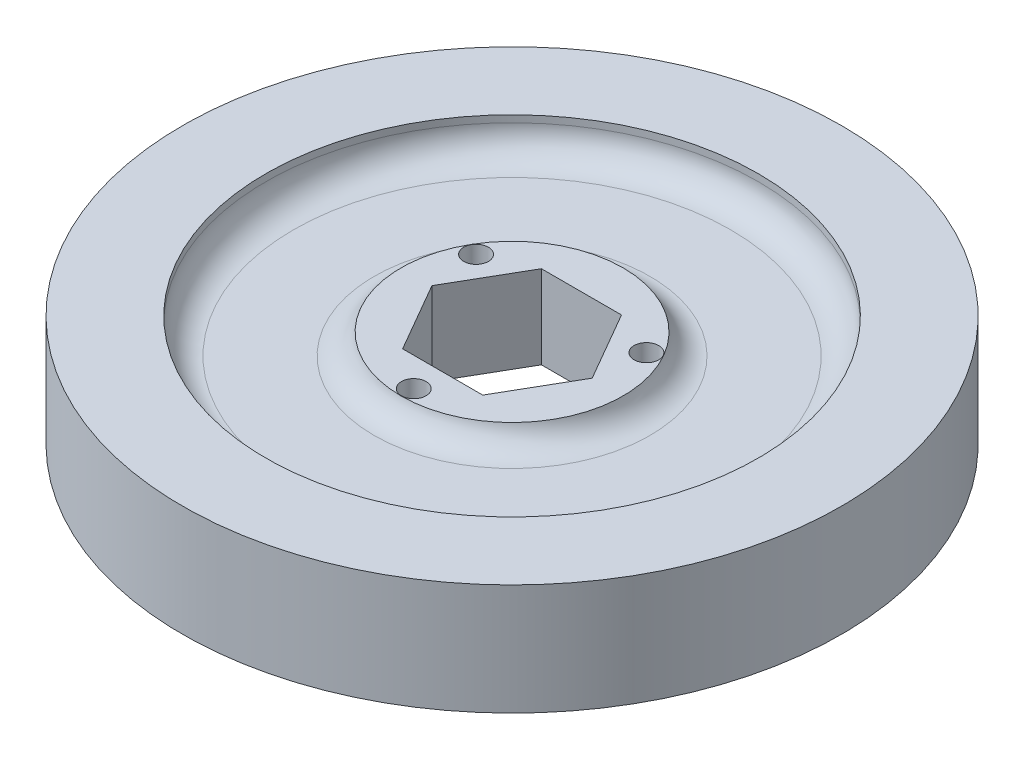
ISO-10303-21;
HEADER;
FILE_DESCRIPTION(('STEP AP214'),'2;1');
FILE_NAME('part.step','',(''),(''),'','','');
FILE_SCHEMA(('AUTOMOTIVE_DESIGN { 1 0 10303 214 1 1 1 1 }'));
ENDSEC;
DATA;
#1=APPLICATION_CONTEXT('core data for automotive mechanical design processes');
#2=APPLICATION_PROTOCOL_DEFINITION('international standard','automotive_design',2000,#1);
#3=PRODUCT_CONTEXT('',#1,'mechanical');
#4=PRODUCT('Part','Part','',(#3));
#5=PRODUCT_RELATED_PRODUCT_CATEGORY('part','',(#4));
#6=PRODUCT_DEFINITION_FORMATION('','',#4);
#7=PRODUCT_DEFINITION_CONTEXT('part definition',#1,'design');
#8=PRODUCT_DEFINITION('design','',#6,#7);
#9=PRODUCT_DEFINITION_SHAPE('','',#8);
#10=(LENGTH_UNIT() NAMED_UNIT(*) SI_UNIT(.MILLI.,.METRE.));
#11=(NAMED_UNIT(*) PLANE_ANGLE_UNIT() SI_UNIT($,.RADIAN.));
#12=(NAMED_UNIT(*) SI_UNIT($,.STERADIAN.) SOLID_ANGLE_UNIT());
#13=UNCERTAINTY_MEASURE_WITH_UNIT(LENGTH_MEASURE(1.E-05),#10,'distance_accuracy_value','');
#14=(GEOMETRIC_REPRESENTATION_CONTEXT(3) GLOBAL_UNCERTAINTY_ASSIGNED_CONTEXT((#13)) GLOBAL_UNIT_ASSIGNED_CONTEXT((#10,
#11,#12)) REPRESENTATION_CONTEXT('',''));
#15=CARTESIAN_POINT('',(0.,0.,0.));
#16=DIRECTION('',(0.,0.,1.));
#17=DIRECTION('',(1.,0.,0.));
#18=AXIS2_PLACEMENT_3D('',#15,#16,#17);
#19=CARTESIAN_POINT('',(0.,-3.81,0.));
#20=DIRECTION('',(0.,-1.,0.));
#21=DIRECTION('',(0.,0.,-1.));
#22=AXIS2_PLACEMENT_3D('',#19,#20,#21);
#23=PLANE('',#22);
#24=CARTESIAN_POINT('',(0.,-3.81,9.00000000000001));
#25=DIRECTION('',(0.,-1.,0.));
#26=DIRECTION('',(0.,0.,-1.));
#27=AXIS2_PLACEMENT_3D('',#24,#25,#26);
#28=CIRCLE('',#27,1.1303);
#29=CARTESIAN_POINT('',(0.,-3.81,7.86970000000001));
#30=VERTEX_POINT('',#29);
#31=EDGE_CURVE('E196',#30,#30,#28,.T.);
#32=ORIENTED_EDGE('',*,*,#31,.F.);
#33=EDGE_LOOP('',(#32));
#34=FACE_BOUND('',#33,.T.);
#35=CARTESIAN_POINT('',(-7.79422863405995,-3.81,-4.5));
#36=DIRECTION('',(0.,-1.,0.));
#37=DIRECTION('',(0.,0.,-1.));
#38=AXIS2_PLACEMENT_3D('',#35,#36,#37);
#39=CIRCLE('',#38,1.1303);
#40=CARTESIAN_POINT('',(-7.79422863405995,-3.81,-5.6303));
#41=VERTEX_POINT('',#40);
#42=EDGE_CURVE('E190',#41,#41,#39,.T.);
#43=ORIENTED_EDGE('',*,*,#42,.F.);
#44=EDGE_LOOP('',(#43));
#45=FACE_BOUND('',#44,.T.);
#46=CARTESIAN_POINT('',(7.79422863405991,-3.81,-4.50000000000007));
#47=DIRECTION('',(0.,-1.,0.));
#48=DIRECTION('',(0.,0.,-1.));
#49=AXIS2_PLACEMENT_3D('',#46,#47,#48);
#50=CIRCLE('',#49,1.1303);
#51=CARTESIAN_POINT('',(7.79422863405991,-3.81,-5.63030000000007));
#52=VERTEX_POINT('',#51);
#53=EDGE_CURVE('E183',#52,#52,#50,.T.);
#54=ORIENTED_EDGE('',*,*,#53,.F.);
#55=EDGE_LOOP('',(#54));
#56=FACE_BOUND('',#55,.T.);
#57=DIRECTION('',(-0.5,0.,0.866025403784438));
#58=VECTOR('',#57,1.);
#59=CARTESIAN_POINT('',(7.33234841870825,-3.81,0.));
#60=LINE('',#59,#58);
#61=CARTESIAN_POINT('',(7.33234841870825,-3.81,0.));
#62=VERTEX_POINT('',#61);
#63=CARTESIAN_POINT('',(3.66617420935412,-3.81,6.35));
#64=VERTEX_POINT('',#63);
#65=EDGE_CURVE('E49',#62,#64,#60,.T.);
#66=ORIENTED_EDGE('',*,*,#65,.F.);
#67=DIRECTION('',(0.5,0.,0.866025403784438));
#68=VECTOR('',#67,1.);
#69=CARTESIAN_POINT('',(3.66617420935412,-3.81,-6.35));
#70=LINE('',#69,#68);
#71=CARTESIAN_POINT('',(3.66617420935412,-3.81,-6.35));
#72=VERTEX_POINT('',#71);
#73=EDGE_CURVE('E113',#72,#62,#70,.T.);
#74=ORIENTED_EDGE('',*,*,#73,.F.);
#75=DIRECTION('',(1.,0.,0.));
#76=VECTOR('',#75,1.);
#77=CARTESIAN_POINT('',(-3.66617420935412,-3.81,-6.35));
#78=LINE('',#77,#76);
#79=CARTESIAN_POINT('',(-3.66617420935412,-3.81,-6.35));
#80=VERTEX_POINT('',#79);
#81=EDGE_CURVE('E107',#80,#72,#78,.T.);
#82=ORIENTED_EDGE('',*,*,#81,.F.);
#83=DIRECTION('',(0.5,0.,-0.866025403784439));
#84=VECTOR('',#83,1.);
#85=CARTESIAN_POINT('',(-7.33234841870824,-3.81,0.));
#86=LINE('',#85,#84);
#87=CARTESIAN_POINT('',(-7.33234841870824,-3.81,0.));
#88=VERTEX_POINT('',#87);
#89=EDGE_CURVE('E105',#88,#80,#86,.T.);
#90=ORIENTED_EDGE('',*,*,#89,.F.);
#91=DIRECTION('',(-0.5,0.,-0.866025403784439));
#92=VECTOR('',#91,1.);
#93=CARTESIAN_POINT('',(-3.66617420935412,-3.81,6.35));
#94=LINE('',#93,#92);
#95=CARTESIAN_POINT('',(-3.66617420935412,-3.81,6.35));
#96=VERTEX_POINT('',#95);
#97=EDGE_CURVE('E89',#96,#88,#94,.T.);
#98=ORIENTED_EDGE('',*,*,#97,.F.);
#99=DIRECTION('',(-1.,0.,0.));
#100=VECTOR('',#99,1.);
#101=CARTESIAN_POINT('',(3.66617420935412,-3.81,6.35));
#102=LINE('',#101,#100);
#103=EDGE_CURVE('E98',#64,#96,#102,.T.);
#104=ORIENTED_EDGE('',*,*,#103,.F.);
#105=EDGE_LOOP('',(#66,#74,#82,#90,#98,#104));
#106=FACE_BOUND('',#105,.T.);
#107=CARTESIAN_POINT('',(0.,-3.81,0.));
#108=DIRECTION('',(0.,-1.,0.));
#109=DIRECTION('',(0.,0.,-1.));
#110=AXIS2_PLACEMENT_3D('',#107,#108,#109);
#111=CIRCLE('',#110,10.16);
#112=CARTESIAN_POINT('',(0.,-3.81,-10.16));
#113=VERTEX_POINT('',#112);
#114=EDGE_CURVE('E139',#113,#113,#111,.T.);
#115=ORIENTED_EDGE('',*,*,#114,.T.);
#116=EDGE_LOOP('',(#115));
#117=FACE_BOUND('',#116,.T.);
#118=ADVANCED_FACE('F34',(#34,#45,#56,#106,#117),#23,.T.);
#119=CARTESIAN_POINT('',(10.16,-1.90499999999999,0.));
#120=DIRECTION('',(0.,-1.,0.));
#121=DIRECTION('',(0.,0.,-1.));
#122=AXIS2_PLACEMENT_3D('',#119,#120,#121);
#123=PLANE('',#122);
#124=CARTESIAN_POINT('',(0.,-1.90499999999999,0.));
#125=DIRECTION('',(0.,-1.,0.));
#126=DIRECTION('',(0.,0.,-1.));
#127=AXIS2_PLACEMENT_3D('',#124,#125,#126);
#128=CIRCLE('',#127,12.6193444248417);
#129=CARTESIAN_POINT('',(0.,-1.90499999999999,-12.6193444248417));
#130=VERTEX_POINT('',#129);
#131=EDGE_CURVE('E154',#130,#130,#128,.F.);
#132=ORIENTED_EDGE('',*,*,#131,.T.);
#133=EDGE_LOOP('',(#132));
#134=FACE_BOUND('',#133,.T.);
#135=CARTESIAN_POINT('',(0.,-1.90499999999999,0.));
#136=DIRECTION('',(0.,-1.,0.));
#137=DIRECTION('',(0.,0.,-1.));
#138=AXIS2_PLACEMENT_3D('',#135,#136,#137);
#139=CIRCLE('',#138,20.0025);
#140=CARTESIAN_POINT('',(0.,-1.90499999999999,-20.0025));
#141=VERTEX_POINT('',#140);
#142=EDGE_CURVE('E151',#141,#141,#139,.T.);
#143=ORIENTED_EDGE('',*,*,#142,.T.);
#144=EDGE_LOOP('',(#143));
#145=FACE_BOUND('',#144,.T.);
#146=ADVANCED_FACE('F228',(#134,#145),#123,.T.);
#147=CARTESIAN_POINT('',(0.,0.,0.));
#148=DIRECTION('',(0.,-1.,0.));
#149=DIRECTION('',(0.,0.,-1.));
#150=AXIS2_PLACEMENT_3D('',#147,#148,#149);
#151=CYLINDRICAL_SURFACE('',#150,22.5425);
#152=CARTESIAN_POINT('',(0.,-4.44499999999999,0.));
#153=DIRECTION('',(0.,-1.,0.));
#154=DIRECTION('',(0.,0.,-1.));
#155=AXIS2_PLACEMENT_3D('',#152,#153,#154);
#156=CIRCLE('',#155,22.5425);
#157=CARTESIAN_POINT('',(0.,-4.44499999999999,-22.5425));
#158=VERTEX_POINT('',#157);
#159=EDGE_CURVE('E157',#158,#158,#156,.F.);
#160=ORIENTED_EDGE('',*,*,#159,.T.);
#161=EDGE_LOOP('',(#160));
#162=FACE_BOUND('',#161,.T.);
#163=CARTESIAN_POINT('',(0.,-5.07999999999999,0.));
#164=DIRECTION('',(0.,-1.,0.));
#165=DIRECTION('',(0.,0.,-1.));
#166=AXIS2_PLACEMENT_3D('',#163,#164,#165);
#167=CIRCLE('',#166,22.5425);
#168=CARTESIAN_POINT('',(0.,-5.07999999999999,-22.5425));
#169=VERTEX_POINT('',#168);
#170=EDGE_CURVE('E136',#169,#169,#167,.T.);
#171=ORIENTED_EDGE('',*,*,#170,.T.);
#172=EDGE_LOOP('',(#171));
#173=FACE_BOUND('',#172,.T.);
#174=ADVANCED_FACE('F234',(#162,#173),#151,.F.);
#175=CARTESIAN_POINT('',(22.5425,-5.07999999999999,0.));
#176=DIRECTION('',(0.,-1.,0.));
#177=DIRECTION('',(0.,0.,-1.));
#178=AXIS2_PLACEMENT_3D('',#175,#176,#177);
#179=PLANE('',#178);
#180=CARTESIAN_POINT('',(0.,-5.07999999999999,0.));
#181=DIRECTION('',(0.,-1.,0.));
#182=DIRECTION('',(0.,0.,-1.));
#183=AXIS2_PLACEMENT_3D('',#180,#181,#182);
#184=CIRCLE('',#183,30.1625);
#185=CARTESIAN_POINT('',(0.,-5.07999999999999,-30.1625));
#186=VERTEX_POINT('',#185);
#187=EDGE_CURVE('E133',#186,#186,#184,.T.);
#188=ORIENTED_EDGE('',*,*,#187,.T.);
#189=EDGE_LOOP('',(#188));
#190=FACE_BOUND('',#189,.T.);
#191=ORIENTED_EDGE('',*,*,#170,.F.);
#192=EDGE_LOOP('',(#191));
#193=FACE_BOUND('',#192,.T.);
#194=ADVANCED_FACE('F269',(#190,#193),#179,.T.);
#195=CARTESIAN_POINT('',(0.,0.,0.));
#196=DIRECTION('',(0.,-1.,0.));
#197=DIRECTION('',(0.,0.,-1.));
#198=AXIS2_PLACEMENT_3D('',#195,#196,#197);
#199=CYLINDRICAL_SURFACE('',#198,30.1625);
#200=CARTESIAN_POINT('',(0.,5.08000000000001,0.));
#201=DIRECTION('',(0.,-1.,0.));
#202=DIRECTION('',(0.,0.,-1.));
#203=AXIS2_PLACEMENT_3D('',#200,#201,#202);
#204=CIRCLE('',#203,30.1625);
#205=CARTESIAN_POINT('',(0.,5.08000000000001,-30.1625));
#206=VERTEX_POINT('',#205);
#207=EDGE_CURVE('E130',#206,#206,#204,.T.);
#208=ORIENTED_EDGE('',*,*,#207,.T.);
#209=EDGE_LOOP('',(#208));
#210=FACE_BOUND('',#209,.T.);
#211=ORIENTED_EDGE('',*,*,#187,.F.);
#212=EDGE_LOOP('',(#211));
#213=FACE_BOUND('',#212,.T.);
#214=ADVANCED_FACE('F273',(#210,#213),#199,.T.);
#215=CARTESIAN_POINT('',(22.5425,5.08000000000001,0.));
#216=DIRECTION('',(0.,1.,0.));
#217=DIRECTION('',(0.,0.,1.));
#218=AXIS2_PLACEMENT_3D('',#215,#216,#217);
#219=PLANE('',#218);
#220=CARTESIAN_POINT('',(0.,5.08,0.));
#221=DIRECTION('',(0.,-1.,0.));
#222=DIRECTION('',(0.,0.,-1.));
#223=AXIS2_PLACEMENT_3D('',#220,#221,#222);
#224=CIRCLE('',#223,22.5425);
#225=CARTESIAN_POINT('',(0.,5.08,-22.5425));
#226=VERTEX_POINT('',#225);
#227=EDGE_CURVE('E127',#226,#226,#224,.T.);
#228=ORIENTED_EDGE('',*,*,#227,.T.);
#229=EDGE_LOOP('',(#228));
#230=FACE_BOUND('',#229,.T.);
#231=ORIENTED_EDGE('',*,*,#207,.F.);
#232=EDGE_LOOP('',(#231));
#233=FACE_BOUND('',#232,.T.);
#234=ADVANCED_FACE('F279',(#230,#233),#219,.T.);
#235=CARTESIAN_POINT('',(0.,0.,0.));
#236=DIRECTION('',(0.,-1.,0.));
#237=DIRECTION('',(0.,0.,-1.));
#238=AXIS2_PLACEMENT_3D('',#235,#236,#237);
#239=CYLINDRICAL_SURFACE('',#238,22.5425);
#240=CARTESIAN_POINT('',(0.,4.445,0.));
#241=DIRECTION('',(0.,1.,0.));
#242=DIRECTION('',(0.,0.,1.));
#243=AXIS2_PLACEMENT_3D('',#240,#241,#242);
#244=CIRCLE('',#243,22.5425);
#245=CARTESIAN_POINT('',(0.,4.445,22.5425));
#246=VERTEX_POINT('',#245);
#247=EDGE_CURVE('E142',#246,#246,#244,.F.);
#248=ORIENTED_EDGE('',*,*,#247,.T.);
#249=EDGE_LOOP('',(#248));
#250=FACE_BOUND('',#249,.T.);
#251=ORIENTED_EDGE('',*,*,#227,.F.);
#252=EDGE_LOOP('',(#251));
#253=FACE_BOUND('',#252,.T.);
#254=ADVANCED_FACE('F285',(#250,#253),#239,.F.);
#255=CARTESIAN_POINT('',(10.16,1.905,0.));
#256=DIRECTION('',(0.,1.,0.));
#257=DIRECTION('',(0.,0.,1.));
#258=AXIS2_PLACEMENT_3D('',#255,#256,#257);
#259=PLANE('',#258);
#260=CARTESIAN_POINT('',(0.,1.905,0.));
#261=DIRECTION('',(0.,1.,0.));
#262=DIRECTION('',(0.,0.,1.));
#263=AXIS2_PLACEMENT_3D('',#260,#261,#262);
#264=CIRCLE('',#263,20.0025);
#265=CARTESIAN_POINT('',(0.,1.905,20.0025));
#266=VERTEX_POINT('',#265);
#267=EDGE_CURVE('E148',#266,#266,#264,.T.);
#268=ORIENTED_EDGE('',*,*,#267,.T.);
#269=EDGE_LOOP('',(#268));
#270=FACE_BOUND('',#269,.T.);
#271=CARTESIAN_POINT('',(0.,1.905,0.));
#272=DIRECTION('',(0.,1.,0.));
#273=DIRECTION('',(0.,0.,1.));
#274=AXIS2_PLACEMENT_3D('',#271,#272,#273);
#275=CIRCLE('',#274,12.6193444248417);
#276=CARTESIAN_POINT('',(0.,1.905,12.6193444248417));
#277=VERTEX_POINT('',#276);
#278=EDGE_CURVE('E145',#277,#277,#275,.F.);
#279=ORIENTED_EDGE('',*,*,#278,.T.);
#280=EDGE_LOOP('',(#279));
#281=FACE_BOUND('',#280,.T.);
#282=ADVANCED_FACE('F208',(#270,#281),#259,.T.);
#283=CARTESIAN_POINT('',(0.,3.81,0.));
#284=DIRECTION('',(0.,1.,0.));
#285=DIRECTION('',(0.,0.,1.));
#286=AXIS2_PLACEMENT_3D('',#283,#284,#285);
#287=PLANE('',#286);
#288=CARTESIAN_POINT('',(0.,3.81,9.00000000000001));
#289=DIRECTION('',(0.,1.,0.));
#290=DIRECTION('',(0.,0.,1.));
#291=AXIS2_PLACEMENT_3D('',#288,#289,#290);
#292=CIRCLE('',#291,1.1303);
#293=CARTESIAN_POINT('',(0.,3.81,10.1303));
#294=VERTEX_POINT('',#293);
#295=EDGE_CURVE('E199',#294,#294,#292,.T.);
#296=ORIENTED_EDGE('',*,*,#295,.F.);
#297=EDGE_LOOP('',(#296));
#298=FACE_BOUND('',#297,.T.);
#299=CARTESIAN_POINT('',(-7.79422863405995,3.81,-4.5));
#300=DIRECTION('',(0.,1.,0.));
#301=DIRECTION('',(0.,0.,1.));
#302=AXIS2_PLACEMENT_3D('',#299,#300,#301);
#303=CIRCLE('',#302,1.1303);
#304=CARTESIAN_POINT('',(-7.79422863405995,3.81,-3.3697));
#305=VERTEX_POINT('',#304);
#306=EDGE_CURVE('E193',#305,#305,#303,.T.);
#307=ORIENTED_EDGE('',*,*,#306,.F.);
#308=EDGE_LOOP('',(#307));
#309=FACE_BOUND('',#308,.T.);
#310=CARTESIAN_POINT('',(7.79422863405991,3.81,-4.50000000000007));
#311=DIRECTION('',(0.,1.,0.));
#312=DIRECTION('',(0.,0.,1.));
#313=AXIS2_PLACEMENT_3D('',#310,#311,#312);
#314=CIRCLE('',#313,1.1303);
#315=CARTESIAN_POINT('',(7.79422863405991,3.81,-3.36970000000007));
#316=VERTEX_POINT('',#315);
#317=EDGE_CURVE('E185',#316,#316,#314,.T.);
#318=ORIENTED_EDGE('',*,*,#317,.F.);
#319=EDGE_LOOP('',(#318));
#320=FACE_BOUND('',#319,.T.);
#321=DIRECTION('',(0.5,0.,-0.866025403784438));
#322=VECTOR('',#321,1.);
#323=CARTESIAN_POINT('',(5.49926131403119,3.81,3.175));
#324=LINE('',#323,#322);
#325=CARTESIAN_POINT('',(3.66617420935412,3.81,6.35));
#326=VERTEX_POINT('',#325);
#327=CARTESIAN_POINT('',(7.33234841870825,3.81,0.));
#328=VERTEX_POINT('',#327);
#329=EDGE_CURVE('E11',#326,#328,#324,.T.);
#330=ORIENTED_EDGE('',*,*,#329,.F.);
#331=DIRECTION('',(1.,0.,0.));
#332=VECTOR('',#331,1.);
#333=CARTESIAN_POINT('',(0.,3.81,6.35));
#334=LINE('',#333,#332);
#335=CARTESIAN_POINT('',(-3.66617420935412,3.81,6.35));
#336=VERTEX_POINT('',#335);
#337=EDGE_CURVE('E160',#336,#326,#334,.T.);
#338=ORIENTED_EDGE('',*,*,#337,.F.);
#339=DIRECTION('',(0.5,0.,0.866025403784439));
#340=VECTOR('',#339,1.);
#341=CARTESIAN_POINT('',(-5.49926131403118,3.81,3.175));
#342=LINE('',#341,#340);
#343=CARTESIAN_POINT('',(-7.33234841870824,3.81,0.));
#344=VERTEX_POINT('',#343);
#345=EDGE_CURVE('E92',#344,#336,#342,.T.);
#346=ORIENTED_EDGE('',*,*,#345,.F.);
#347=DIRECTION('',(-0.5,0.,0.866025403784439));
#348=VECTOR('',#347,1.);
#349=CARTESIAN_POINT('',(-5.49926131403118,3.81,-3.175));
#350=LINE('',#349,#348);
#351=CARTESIAN_POINT('',(-3.66617420935412,3.81,-6.35));
#352=VERTEX_POINT('',#351);
#353=EDGE_CURVE('E163',#352,#344,#350,.T.);
#354=ORIENTED_EDGE('',*,*,#353,.F.);
#355=DIRECTION('',(-1.,0.,0.));
#356=VECTOR('',#355,1.);
#357=CARTESIAN_POINT('',(0.,3.81,-6.35));
#358=LINE('',#357,#356);
#359=CARTESIAN_POINT('',(3.66617420935412,3.81,-6.35));
#360=VERTEX_POINT('',#359);
#361=EDGE_CURVE('E165',#360,#352,#358,.T.);
#362=ORIENTED_EDGE('',*,*,#361,.F.);
#363=DIRECTION('',(-0.5,0.,-0.866025403784439));
#364=VECTOR('',#363,1.);
#365=CARTESIAN_POINT('',(5.49926131403118,3.81,-3.175));
#366=LINE('',#365,#364);
#367=EDGE_CURVE('E42',#328,#360,#366,.T.);
#368=ORIENTED_EDGE('',*,*,#367,.F.);
#369=EDGE_LOOP('',(#330,#338,#346,#354,#362,#368));
#370=FACE_BOUND('',#369,.T.);
#371=CARTESIAN_POINT('',(0.,3.81,0.));
#372=DIRECTION('',(0.,-1.,0.));
#373=DIRECTION('',(0.,0.,-1.));
#374=AXIS2_PLACEMENT_3D('',#371,#372,#373);
#375=CIRCLE('',#374,10.16);
#376=CARTESIAN_POINT('',(0.,3.81,-10.16));
#377=VERTEX_POINT('',#376);
#378=EDGE_CURVE('E118',#377,#377,#375,.T.);
#379=ORIENTED_EDGE('',*,*,#378,.F.);
#380=EDGE_LOOP('',(#379));
#381=FACE_BOUND('',#380,.T.);
#382=ADVANCED_FACE('F179',(#298,#309,#320,#370,#381),#287,.T.);
#383=CARTESIAN_POINT('',(0.,4.445,0.));
#384=DIRECTION('',(0.,1.,0.));
#385=DIRECTION('',(0.,0.,1.));
#386=AXIS2_PLACEMENT_3D('',#383,#384,#385);
#387=TOROIDAL_SURFACE('',#386,20.0025,2.54);
#388=ORIENTED_EDGE('',*,*,#267,.F.);
#389=EDGE_LOOP('',(#388));
#390=FACE_BOUND('',#389,.T.);
#391=ORIENTED_EDGE('',*,*,#247,.F.);
#392=EDGE_LOOP('',(#391));
#393=FACE_BOUND('',#392,.T.);
#394=ADVANCED_FACE('F207',(#390,#393),#387,.F.);
#395=CARTESIAN_POINT('',(0.,4.445,0.));
#396=DIRECTION('',(0.,1.,0.));
#397=DIRECTION('',(0.,0.,1.));
#398=AXIS2_PLACEMENT_3D('',#395,#396,#397);
#399=TOROIDAL_SURFACE('',#398,12.6193444248417,2.54);
#400=ORIENTED_EDGE('',*,*,#378,.T.);
#401=EDGE_LOOP('',(#400));
#402=FACE_BOUND('',#401,.T.);
#403=ORIENTED_EDGE('',*,*,#278,.F.);
#404=EDGE_LOOP('',(#403));
#405=FACE_BOUND('',#404,.T.);
#406=ADVANCED_FACE('F243',(#402,#405),#399,.F.);
#407=CARTESIAN_POINT('',(0.,-4.44499999999999,0.));
#408=DIRECTION('',(0.,-1.,0.));
#409=DIRECTION('',(0.,0.,-1.));
#410=AXIS2_PLACEMENT_3D('',#407,#408,#409);
#411=TOROIDAL_SURFACE('',#410,12.6193444248417,2.54);
#412=ORIENTED_EDGE('',*,*,#131,.F.);
#413=EDGE_LOOP('',(#412));
#414=FACE_BOUND('',#413,.T.);
#415=ORIENTED_EDGE('',*,*,#114,.F.);
#416=EDGE_LOOP('',(#415));
#417=FACE_BOUND('',#416,.T.);
#418=ADVANCED_FACE('F246',(#414,#417),#411,.F.);
#419=CARTESIAN_POINT('',(0.,-4.44499999999999,0.));
#420=DIRECTION('',(0.,-1.,0.));
#421=DIRECTION('',(0.,0.,-1.));
#422=AXIS2_PLACEMENT_3D('',#419,#420,#421);
#423=TOROIDAL_SURFACE('',#422,20.0025,2.54);
#424=ORIENTED_EDGE('',*,*,#159,.F.);
#425=EDGE_LOOP('',(#424));
#426=FACE_BOUND('',#425,.T.);
#427=ORIENTED_EDGE('',*,*,#142,.F.);
#428=EDGE_LOOP('',(#427));
#429=FACE_BOUND('',#428,.T.);
#430=ADVANCED_FACE('F36',(#426,#429),#423,.F.);
#431=CARTESIAN_POINT('',(7.33234841870825,5.08000000000001,0.));
#432=DIRECTION('',(0.866025403784438,0.,0.5));
#433=DIRECTION('',(0.5,0.,-0.866025403784438));
#434=AXIS2_PLACEMENT_3D('',#431,#432,#433);
#435=PLANE('',#434);
#436=ORIENTED_EDGE('',*,*,#329,.T.);
#437=DIRECTION('',(0.,-1.,0.));
#438=VECTOR('',#437,1.);
#439=CARTESIAN_POINT('',(7.33234841870825,5.08000000000001,0.));
#440=LINE('',#439,#438);
#441=EDGE_CURVE('E116',#328,#62,#440,.T.);
#442=ORIENTED_EDGE('',*,*,#441,.T.);
#443=ORIENTED_EDGE('',*,*,#65,.T.);
#444=DIRECTION('',(0.,-1.,0.));
#445=VECTOR('',#444,1.);
#446=CARTESIAN_POINT('',(3.66617420935412,5.08000000000001,6.35));
#447=LINE('',#446,#445);
#448=EDGE_CURVE('E95',#326,#64,#447,.T.);
#449=ORIENTED_EDGE('',*,*,#448,.F.);
#450=EDGE_LOOP('',(#436,#442,#443,#449));
#451=FACE_BOUND('',#450,.T.);
#452=ADVANCED_FACE('F253',(#451),#435,.F.);
#453=CARTESIAN_POINT('',(3.66617420935412,5.08000000000001,-6.35));
#454=DIRECTION('',(0.866025403784439,0.,-0.5));
#455=DIRECTION('',(-0.5,0.,-0.866025403784439));
#456=AXIS2_PLACEMENT_3D('',#453,#454,#455);
#457=PLANE('',#456);
#458=ORIENTED_EDGE('',*,*,#367,.T.);
#459=DIRECTION('',(0.,-1.,0.));
#460=VECTOR('',#459,1.);
#461=CARTESIAN_POINT('',(3.66617420935412,5.08000000000001,-6.35));
#462=LINE('',#461,#460);
#463=EDGE_CURVE('E119',#360,#72,#462,.T.);
#464=ORIENTED_EDGE('',*,*,#463,.T.);
#465=ORIENTED_EDGE('',*,*,#73,.T.);
#466=ORIENTED_EDGE('',*,*,#441,.F.);
#467=EDGE_LOOP('',(#458,#464,#465,#466));
#468=FACE_BOUND('',#467,.T.);
#469=ADVANCED_FACE('F170',(#468),#457,.F.);
#470=CARTESIAN_POINT('',(-3.66617420935412,5.08000000000001,-6.35));
#471=DIRECTION('',(0.,0.,-1.));
#472=DIRECTION('',(-1.,0.,0.));
#473=AXIS2_PLACEMENT_3D('',#470,#471,#472);
#474=PLANE('',#473);
#475=ORIENTED_EDGE('',*,*,#361,.T.);
#476=DIRECTION('',(0.,-1.,0.));
#477=VECTOR('',#476,1.);
#478=CARTESIAN_POINT('',(-3.66617420935412,5.08000000000001,-6.35));
#479=LINE('',#478,#477);
#480=EDGE_CURVE('E121',#352,#80,#479,.T.);
#481=ORIENTED_EDGE('',*,*,#480,.T.);
#482=ORIENTED_EDGE('',*,*,#81,.T.);
#483=ORIENTED_EDGE('',*,*,#463,.F.);
#484=EDGE_LOOP('',(#475,#481,#482,#483));
#485=FACE_BOUND('',#484,.T.);
#486=ADVANCED_FACE('F175',(#485),#474,.F.);
#487=CARTESIAN_POINT('',(-7.33234841870824,5.08000000000001,0.));
#488=DIRECTION('',(-0.866025403784439,0.,-0.5));
#489=DIRECTION('',(-0.5,0.,0.866025403784439));
#490=AXIS2_PLACEMENT_3D('',#487,#488,#489);
#491=PLANE('',#490);
#492=ORIENTED_EDGE('',*,*,#353,.T.);
#493=DIRECTION('',(0.,-1.,0.));
#494=VECTOR('',#493,1.);
#495=CARTESIAN_POINT('',(-7.33234841870824,5.08000000000001,0.));
#496=LINE('',#495,#494);
#497=EDGE_CURVE('E94',#344,#88,#496,.T.);
#498=ORIENTED_EDGE('',*,*,#497,.T.);
#499=ORIENTED_EDGE('',*,*,#89,.T.);
#500=ORIENTED_EDGE('',*,*,#480,.F.);
#501=EDGE_LOOP('',(#492,#498,#499,#500));
#502=FACE_BOUND('',#501,.T.);
#503=ADVANCED_FACE('F182',(#502),#491,.F.);
#504=CARTESIAN_POINT('',(-3.66617420935412,5.08000000000001,6.35));
#505=DIRECTION('',(-0.866025403784439,0.,0.5));
#506=DIRECTION('',(0.5,0.,0.866025403784439));
#507=AXIS2_PLACEMENT_3D('',#504,#505,#506);
#508=PLANE('',#507);
#509=ORIENTED_EDGE('',*,*,#345,.T.);
#510=DIRECTION('',(0.,-1.,0.));
#511=VECTOR('',#510,1.);
#512=CARTESIAN_POINT('',(-3.66617420935412,5.08000000000001,6.35));
#513=LINE('',#512,#511);
#514=EDGE_CURVE('E57',#336,#96,#513,.T.);
#515=ORIENTED_EDGE('',*,*,#514,.T.);
#516=ORIENTED_EDGE('',*,*,#97,.T.);
#517=ORIENTED_EDGE('',*,*,#497,.F.);
#518=EDGE_LOOP('',(#509,#515,#516,#517));
#519=FACE_BOUND('',#518,.T.);
#520=ADVANCED_FACE('F86',(#519),#508,.F.);
#521=CARTESIAN_POINT('',(3.66617420935412,5.08000000000001,6.35));
#522=DIRECTION('',(0.,0.,1.));
#523=DIRECTION('',(1.,0.,0.));
#524=AXIS2_PLACEMENT_3D('',#521,#522,#523);
#525=PLANE('',#524);
#526=ORIENTED_EDGE('',*,*,#337,.T.);
#527=ORIENTED_EDGE('',*,*,#448,.T.);
#528=ORIENTED_EDGE('',*,*,#103,.T.);
#529=ORIENTED_EDGE('',*,*,#514,.F.);
#530=EDGE_LOOP('',(#526,#527,#528,#529));
#531=FACE_BOUND('',#530,.T.);
#532=ADVANCED_FACE('F99',(#531),#525,.F.);
#533=CARTESIAN_POINT('',(7.79422863405991,3.81,-4.50000000000007));
#534=DIRECTION('',(0.,1.,0.));
#535=DIRECTION('',(0.,0.,1.));
#536=AXIS2_PLACEMENT_3D('',#533,#534,#535);
#537=CYLINDRICAL_SURFACE('',#536,1.1303);
#538=ORIENTED_EDGE('',*,*,#53,.T.);
#539=EDGE_LOOP('',(#538));
#540=FACE_BOUND('',#539,.T.);
#541=ORIENTED_EDGE('',*,*,#317,.T.);
#542=EDGE_LOOP('',(#541));
#543=FACE_BOUND('',#542,.T.);
#544=ADVANCED_FACE('F214',(#540,#543),#537,.F.);
#545=CARTESIAN_POINT('',(-7.79422863405995,3.81,-4.5));
#546=DIRECTION('',(0.,1.,0.));
#547=DIRECTION('',(0.,0.,1.));
#548=AXIS2_PLACEMENT_3D('',#545,#546,#547);
#549=CYLINDRICAL_SURFACE('',#548,1.1303);
#550=ORIENTED_EDGE('',*,*,#42,.T.);
#551=EDGE_LOOP('',(#550));
#552=FACE_BOUND('',#551,.T.);
#553=ORIENTED_EDGE('',*,*,#306,.T.);
#554=EDGE_LOOP('',(#553));
#555=FACE_BOUND('',#554,.T.);
#556=ADVANCED_FACE('F216',(#552,#555),#549,.F.);
#557=CARTESIAN_POINT('',(0.,3.81,9.00000000000001));
#558=DIRECTION('',(0.,1.,0.));
#559=DIRECTION('',(0.,0.,1.));
#560=AXIS2_PLACEMENT_3D('',#557,#558,#559);
#561=CYLINDRICAL_SURFACE('',#560,1.1303);
#562=ORIENTED_EDGE('',*,*,#31,.T.);
#563=EDGE_LOOP('',(#562));
#564=FACE_BOUND('',#563,.T.);
#565=ORIENTED_EDGE('',*,*,#295,.T.);
#566=EDGE_LOOP('',(#565));
#567=FACE_BOUND('',#566,.T.);
#568=ADVANCED_FACE('F203',(#564,#567),#561,.F.);
#569=CLOSED_SHELL('',(#118,#146,#174,#194,#214,#234,#254,#282,#382,#394,#406,#418,#430,#452,
#469,#486,#503,#520,#532,#544,#556,#568));
#570=MANIFOLD_SOLID_BREP('B2',#569);
#571=ADVANCED_BREP_SHAPE_REPRESENTATION('',(#18,#570),#14);
#572=SHAPE_DEFINITION_REPRESENTATION(#9,#571);
ENDSEC;
END-ISO-10303-21;
